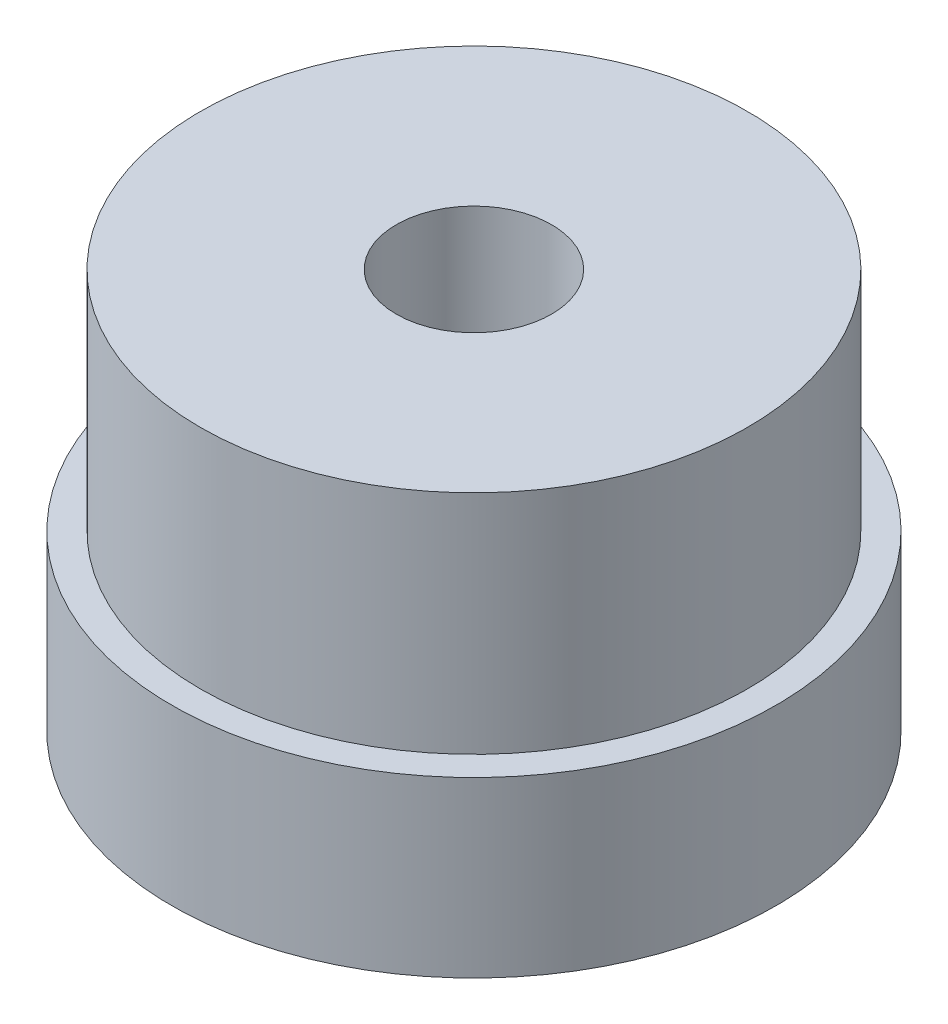
ISO-10303-21;
HEADER;
FILE_DESCRIPTION(('STEP AP214'),'2;1');
FILE_NAME('part.step','',(''),(''),'','','');
FILE_SCHEMA(('AUTOMOTIVE_DESIGN { 1 0 10303 214 1 1 1 1 }'));
ENDSEC;
DATA;
#1=APPLICATION_CONTEXT('core data for automotive mechanical design processes');
#2=APPLICATION_PROTOCOL_DEFINITION('international standard','automotive_design',2000,#1);
#3=PRODUCT_CONTEXT('',#1,'mechanical');
#4=PRODUCT('Part','Part','',(#3));
#5=PRODUCT_RELATED_PRODUCT_CATEGORY('part','',(#4));
#6=PRODUCT_DEFINITION_FORMATION('','',#4);
#7=PRODUCT_DEFINITION_CONTEXT('part definition',#1,'design');
#8=PRODUCT_DEFINITION('design','',#6,#7);
#9=PRODUCT_DEFINITION_SHAPE('','',#8);
#10=(LENGTH_UNIT() NAMED_UNIT(*) SI_UNIT(.MILLI.,.METRE.));
#11=(NAMED_UNIT(*) PLANE_ANGLE_UNIT() SI_UNIT($,.RADIAN.));
#12=(NAMED_UNIT(*) SI_UNIT($,.STERADIAN.) SOLID_ANGLE_UNIT());
#13=UNCERTAINTY_MEASURE_WITH_UNIT(LENGTH_MEASURE(1.E-05),#10,'distance_accuracy_value','');
#14=(GEOMETRIC_REPRESENTATION_CONTEXT(3) GLOBAL_UNCERTAINTY_ASSIGNED_CONTEXT((#13)) GLOBAL_UNIT_ASSIGNED_CONTEXT((#10,
#11,#12)) REPRESENTATION_CONTEXT('',''));
#15=CARTESIAN_POINT('',(0.,0.,0.));
#16=DIRECTION('',(0.,0.,1.));
#17=DIRECTION('',(1.,0.,0.));
#18=AXIS2_PLACEMENT_3D('',#15,#16,#17);
#19=CARTESIAN_POINT('',(0.,16.8275,0.));
#20=DIRECTION('',(0.,-1.,0.));
#21=DIRECTION('',(0.,0.,-1.));
#22=AXIS2_PLACEMENT_3D('',#19,#20,#21);
#23=CYLINDRICAL_SURFACE('',#22,3.2639);
#24=CARTESIAN_POINT('',(0.,16.8275,0.));
#25=DIRECTION('',(0.,1.,0.));
#26=DIRECTION('',(0.,0.,1.));
#27=AXIS2_PLACEMENT_3D('',#24,#25,#26);
#28=CIRCLE('',#27,3.2639);
#29=CARTESIAN_POINT('',(0.,16.8275,3.2639));
#30=VERTEX_POINT('',#29);
#31=EDGE_CURVE('E53',#30,#30,#28,.T.);
#32=ORIENTED_EDGE('',*,*,#31,.T.);
#33=EDGE_LOOP('',(#32));
#34=FACE_BOUND('',#33,.T.);
#35=CARTESIAN_POINT('',(0.,0.,0.));
#36=DIRECTION('',(0.,1.,0.));
#37=DIRECTION('',(0.,0.,1.));
#38=AXIS2_PLACEMENT_3D('',#35,#36,#37);
#39=CIRCLE('',#38,3.2639);
#40=CARTESIAN_POINT('',(0.,0.,3.2639));
#41=VERTEX_POINT('',#40);
#42=EDGE_CURVE('E48',#41,#41,#39,.T.);
#43=ORIENTED_EDGE('',*,*,#42,.F.);
#44=EDGE_LOOP('',(#43));
#45=FACE_BOUND('',#44,.T.);
#46=ADVANCED_FACE('F45',(#34,#45),#23,.F.);
#47=CARTESIAN_POINT('',(0.,16.8275,0.));
#48=DIRECTION('',(0.,-1.,0.));
#49=DIRECTION('',(0.,0.,-1.));
#50=AXIS2_PLACEMENT_3D('',#47,#48,#49);
#51=CYLINDRICAL_SURFACE('',#50,11.5062);
#52=CARTESIAN_POINT('',(0.,7.3025,0.));
#53=DIRECTION('',(0.,1.,0.));
#54=DIRECTION('',(0.,0.,1.));
#55=AXIS2_PLACEMENT_3D('',#52,#53,#54);
#56=CIRCLE('',#55,11.5062);
#57=CARTESIAN_POINT('',(0.,7.3025,11.5062));
#58=VERTEX_POINT('',#57);
#59=EDGE_CURVE('E64',#58,#58,#56,.T.);
#60=ORIENTED_EDGE('',*,*,#59,.T.);
#61=EDGE_LOOP('',(#60));
#62=FACE_BOUND('',#61,.T.);
#63=CARTESIAN_POINT('',(0.,16.8275,0.));
#64=DIRECTION('',(0.,1.,0.));
#65=DIRECTION('',(0.,0.,1.));
#66=AXIS2_PLACEMENT_3D('',#63,#64,#65);
#67=CIRCLE('',#66,11.5062);
#68=CARTESIAN_POINT('',(0.,16.8275,11.5062));
#69=VERTEX_POINT('',#68);
#70=EDGE_CURVE('E10',#69,#69,#67,.T.);
#71=ORIENTED_EDGE('',*,*,#70,.F.);
#72=EDGE_LOOP('',(#71));
#73=FACE_BOUND('',#72,.T.);
#74=ADVANCED_FACE('F73',(#62,#73),#51,.T.);
#75=CARTESIAN_POINT('',(0.,16.8275,0.));
#76=DIRECTION('',(0.,1.,0.));
#77=DIRECTION('',(0.,0.,1.));
#78=AXIS2_PLACEMENT_3D('',#75,#76,#77);
#79=PLANE('',#78);
#80=ORIENTED_EDGE('',*,*,#31,.F.);
#81=EDGE_LOOP('',(#80));
#82=FACE_BOUND('',#81,.T.);
#83=ORIENTED_EDGE('',*,*,#70,.T.);
#84=EDGE_LOOP('',(#83));
#85=FACE_BOUND('',#84,.T.);
#86=ADVANCED_FACE('F90',(#82,#85),#79,.T.);
#87=CARTESIAN_POINT('',(0.,0.,0.));
#88=DIRECTION('',(0.,1.,0.));
#89=DIRECTION('',(0.,0.,1.));
#90=AXIS2_PLACEMENT_3D('',#87,#88,#89);
#91=PLANE('',#90);
#92=ORIENTED_EDGE('',*,*,#42,.T.);
#93=EDGE_LOOP('',(#92));
#94=FACE_BOUND('',#93,.T.);
#95=CARTESIAN_POINT('',(0.,0.,0.));
#96=DIRECTION('',(0.,1.,0.));
#97=DIRECTION('',(0.,0.,1.));
#98=AXIS2_PLACEMENT_3D('',#95,#96,#97);
#99=CIRCLE('',#98,12.7);
#100=CARTESIAN_POINT('',(0.,0.,-12.7));
#101=VERTEX_POINT('',#100);
#102=EDGE_CURVE('E60',#101,#101,#99,.T.);
#103=ORIENTED_EDGE('',*,*,#102,.F.);
#104=EDGE_LOOP('',(#103));
#105=FACE_BOUND('',#104,.T.);
#106=ADVANCED_FACE('F85',(#94,#105),#91,.F.);
#107=CARTESIAN_POINT('',(0.,7.3025,0.));
#108=DIRECTION('',(0.,-1.,0.));
#109=DIRECTION('',(0.,0.,-1.));
#110=AXIS2_PLACEMENT_3D('',#107,#108,#109);
#111=CYLINDRICAL_SURFACE('',#110,12.7);
#112=CARTESIAN_POINT('',(0.,7.3025,0.));
#113=DIRECTION('',(0.,1.,0.));
#114=DIRECTION('',(0.,0.,1.));
#115=AXIS2_PLACEMENT_3D('',#112,#113,#114);
#116=CIRCLE('',#115,12.7);
#117=CARTESIAN_POINT('',(0.,7.3025,-12.7));
#118=VERTEX_POINT('',#117);
#119=EDGE_CURVE('E65',#118,#118,#116,.T.);
#120=CARTESIAN_POINT('',(0.,7.3025,-12.7));
#121=CARTESIAN_POINT('',(0.,7.22643229166667,-12.7));
#122=CARTESIAN_POINT('',(0.,7.15036458333333,-12.7));
#123=CARTESIAN_POINT('',(0.,6.99822916666667,-12.7));
#124=CARTESIAN_POINT('',(0.,6.92216145833333,-12.7));
#125=CARTESIAN_POINT('',(0.,6.77002604166667,-12.7));
#126=CARTESIAN_POINT('',(0.,6.69395833333333,-12.7));
#127=CARTESIAN_POINT('',(0.,6.54182291666667,-12.7));
#128=CARTESIAN_POINT('',(0.,6.46575520833333,-12.7));
#129=CARTESIAN_POINT('',(0.,6.31361979166667,-12.7));
#130=CARTESIAN_POINT('',(0.,6.23755208333333,-12.7));
#131=CARTESIAN_POINT('',(0.,6.08541666666667,-12.7));
#132=CARTESIAN_POINT('',(0.,6.00934895833333,-12.7));
#133=CARTESIAN_POINT('',(0.,5.85721354166667,-12.7));
#134=CARTESIAN_POINT('',(0.,5.78114583333333,-12.7));
#135=CARTESIAN_POINT('',(0.,5.62901041666667,-12.7));
#136=CARTESIAN_POINT('',(0.,5.55294270833333,-12.7));
#137=CARTESIAN_POINT('',(0.,5.40080729166667,-12.7));
#138=CARTESIAN_POINT('',(0.,5.32473958333333,-12.7));
#139=CARTESIAN_POINT('',(0.,5.17260416666667,-12.7));
#140=CARTESIAN_POINT('',(0.,5.09653645833333,-12.7));
#141=CARTESIAN_POINT('',(0.,4.94440104166667,-12.7));
#142=CARTESIAN_POINT('',(0.,4.86833333333333,-12.7));
#143=CARTESIAN_POINT('',(0.,4.71619791666667,-12.7));
#144=CARTESIAN_POINT('',(0.,4.64013020833333,-12.7));
#145=CARTESIAN_POINT('',(0.,4.48799479166667,-12.7));
#146=CARTESIAN_POINT('',(0.,4.41192708333333,-12.7));
#147=CARTESIAN_POINT('',(0.,4.25979166666667,-12.7));
#148=CARTESIAN_POINT('',(0.,4.18372395833333,-12.7));
#149=CARTESIAN_POINT('',(0.,4.03158854166667,-12.7));
#150=CARTESIAN_POINT('',(0.,3.95552083333333,-12.7));
#151=CARTESIAN_POINT('',(0.,3.80338541666667,-12.7));
#152=CARTESIAN_POINT('',(0.,3.72731770833333,-12.7));
#153=CARTESIAN_POINT('',(0.,3.57518229166667,-12.7));
#154=CARTESIAN_POINT('',(0.,3.49911458333333,-12.7));
#155=CARTESIAN_POINT('',(0.,3.34697916666667,-12.7));
#156=CARTESIAN_POINT('',(0.,3.27091145833333,-12.7));
#157=CARTESIAN_POINT('',(0.,3.11877604166667,-12.7));
#158=CARTESIAN_POINT('',(0.,3.04270833333333,-12.7));
#159=CARTESIAN_POINT('',(0.,2.89057291666667,-12.7));
#160=CARTESIAN_POINT('',(0.,2.81450520833333,-12.7));
#161=CARTESIAN_POINT('',(0.,2.66236979166667,-12.7));
#162=CARTESIAN_POINT('',(0.,2.58630208333333,-12.7));
#163=CARTESIAN_POINT('',(0.,2.43416666666667,-12.7));
#164=CARTESIAN_POINT('',(0.,2.35809895833333,-12.7));
#165=CARTESIAN_POINT('',(0.,2.20596354166667,-12.7));
#166=CARTESIAN_POINT('',(0.,2.12989583333333,-12.7));
#167=CARTESIAN_POINT('',(0.,1.97776041666667,-12.7));
#168=CARTESIAN_POINT('',(0.,1.90169270833333,-12.7));
#169=CARTESIAN_POINT('',(0.,1.74955729166667,-12.7));
#170=CARTESIAN_POINT('',(0.,1.67348958333333,-12.7));
#171=CARTESIAN_POINT('',(0.,1.52135416666667,-12.7));
#172=CARTESIAN_POINT('',(0.,1.44528645833333,-12.7));
#173=CARTESIAN_POINT('',(0.,1.29315104166667,-12.7));
#174=CARTESIAN_POINT('',(0.,1.21708333333333,-12.7));
#175=CARTESIAN_POINT('',(0.,1.06494791666667,-12.7));
#176=CARTESIAN_POINT('',(0.,0.988880208333333,-12.7));
#177=CARTESIAN_POINT('',(0.,0.836744791666666,-12.7));
#178=CARTESIAN_POINT('',(0.,0.760677083333333,-12.7));
#179=CARTESIAN_POINT('',(0.,0.608541666666667,-12.7));
#180=CARTESIAN_POINT('',(0.,0.532473958333333,-12.7));
#181=CARTESIAN_POINT('',(0.,0.380338541666667,-12.7));
#182=CARTESIAN_POINT('',(0.,0.304270833333333,-12.7));
#183=CARTESIAN_POINT('',(0.,0.152135416666666,-12.7));
#184=CARTESIAN_POINT('',(0.,0.0760677083333332,-12.7));
#185=CARTESIAN_POINT('',(0.,0.,-12.7));
#186=B_SPLINE_CURVE_WITH_KNOTS('',3,(#120,#121,#122,#123,#124,#125,#126,#127,#128,#129,#130,
#131,#132,#133,#134,#135,#136,#137,#138,#139,#140,#141,#142,#143,#144,#145,#146,#147,#148,#149,
#150,#151,#152,#153,#154,#155,#156,#157,#158,#159,#160,#161,#162,#163,#164,#165,#166,#167,#168,
#169,#170,#171,#172,#173,#174,#175,#176,#177,#178,#179,#180,#181,#182,#183,#184,#185),
.UNSPECIFIED.,.F.,.F.,(4,2,2,2,2,2,2,2,2,2,2,2,2,2,2,2,2,2,2,2,2,2,2,2,2,2,2,2,2,2,2,2,4),(0.,
0.228203125,0.456406249999999,0.684609374999999,0.9128125,1.141015625,1.36921875,1.597421875,
1.825625,2.053828125,2.28203125,2.510234375,2.7384375,2.966640625,3.19484375,3.423046875,
3.65125,3.879453125,4.10765625,4.335859375,4.5640625,4.792265625,5.02046875,5.248671875,
5.476875,5.705078125,5.93328125,6.161484375,6.3896875,6.617890625,6.84609375,7.074296875,
7.3025),.UNSPECIFIED.);
#187=EDGE_CURVE('BSEAM79',#118,#101,#186,.T.);
#188=ORIENTED_EDGE('',*,*,#119,.F.);
#189=ORIENTED_EDGE('',*,*,#102,.T.);
#190=ORIENTED_EDGE('',*,*,#187,.T.);
#191=ORIENTED_EDGE('',*,*,#187,.F.);
#192=EDGE_LOOP('',(#188,#190,#189,#191));
#193=FACE_BOUND('',#192,.T.);
#194=ADVANCED_FACE('F79',(#193),#111,.T.);
#195=CARTESIAN_POINT('',(0.,7.3025,0.));
#196=DIRECTION('',(0.,1.,0.));
#197=DIRECTION('',(0.,0.,1.));
#198=AXIS2_PLACEMENT_3D('',#195,#196,#197);
#199=PLANE('',#198);
#200=ORIENTED_EDGE('',*,*,#59,.F.);
#201=EDGE_LOOP('',(#200));
#202=FACE_BOUND('',#201,.T.);
#203=ORIENTED_EDGE('',*,*,#119,.T.);
#204=EDGE_LOOP('',(#203));
#205=FACE_BOUND('',#204,.T.);
#206=ADVANCED_FACE('F76',(#202,#205),#199,.T.);
#207=CLOSED_SHELL('',(#46,#74,#86,#106,#194,#206));
#208=MANIFOLD_SOLID_BREP('B2',#207);
#209=ADVANCED_BREP_SHAPE_REPRESENTATION('',(#18,#208),#14);
#210=SHAPE_DEFINITION_REPRESENTATION(#9,#209);
ENDSEC;
END-ISO-10303-21;
